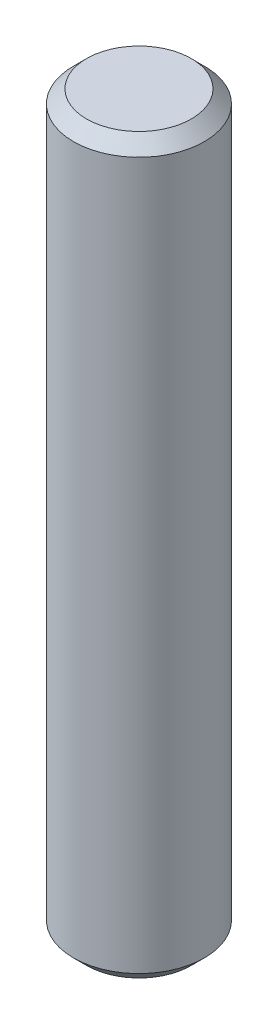
ISO-10303-21;
HEADER;
FILE_DESCRIPTION(('STEP AP214'),'2;1');
FILE_NAME('part.step','',(''),(''),'','','');
FILE_SCHEMA(('AUTOMOTIVE_DESIGN { 1 0 10303 214 1 1 1 1 }'));
ENDSEC;
DATA;
#1=APPLICATION_CONTEXT('core data for automotive mechanical design processes');
#2=APPLICATION_PROTOCOL_DEFINITION('international standard','automotive_design',2000,#1);
#3=PRODUCT_CONTEXT('',#1,'mechanical');
#4=PRODUCT('Part','Part','',(#3));
#5=PRODUCT_RELATED_PRODUCT_CATEGORY('part','',(#4));
#6=PRODUCT_DEFINITION_FORMATION('','',#4);
#7=PRODUCT_DEFINITION_CONTEXT('part definition',#1,'design');
#8=PRODUCT_DEFINITION('design','',#6,#7);
#9=PRODUCT_DEFINITION_SHAPE('','',#8);
#10=(LENGTH_UNIT() NAMED_UNIT(*) SI_UNIT(.MILLI.,.METRE.));
#11=(NAMED_UNIT(*) PLANE_ANGLE_UNIT() SI_UNIT($,.RADIAN.));
#12=(NAMED_UNIT(*) SI_UNIT($,.STERADIAN.) SOLID_ANGLE_UNIT());
#13=UNCERTAINTY_MEASURE_WITH_UNIT(LENGTH_MEASURE(1.E-05),#10,'distance_accuracy_value','');
#14=(GEOMETRIC_REPRESENTATION_CONTEXT(3) GLOBAL_UNCERTAINTY_ASSIGNED_CONTEXT((#13)) GLOBAL_UNIT_ASSIGNED_CONTEXT((#10,
#11,#12)) REPRESENTATION_CONTEXT('',''));
#15=CARTESIAN_POINT('',(0.,0.,0.));
#16=DIRECTION('',(0.,0.,1.));
#17=DIRECTION('',(1.,0.,0.));
#18=AXIS2_PLACEMENT_3D('',#15,#16,#17);
#19=CARTESIAN_POINT('',(0.,-14.,0.));
#20=DIRECTION('',(0.,1.,0.));
#21=DIRECTION('',(0.,0.,1.));
#22=AXIS2_PLACEMENT_3D('',#19,#20,#21);
#23=CYLINDRICAL_SURFACE('',#22,2.5);
#24=CARTESIAN_POINT('',(0.,-13.5,0.));
#25=DIRECTION('',(0.,1.,0.));
#26=DIRECTION('',(0.,0.,1.));
#27=AXIS2_PLACEMENT_3D('',#24,#25,#26);
#28=CIRCLE('',#27,2.5);
#29=CARTESIAN_POINT('',(0.,-13.5,2.5));
#30=VERTEX_POINT('',#29);
#31=EDGE_CURVE('E43',#30,#30,#28,.T.);
#32=ORIENTED_EDGE('',*,*,#31,.T.);
#33=EDGE_LOOP('',(#32));
#34=FACE_BOUND('',#33,.T.);
#35=CARTESIAN_POINT('',(0.,13.5,0.));
#36=DIRECTION('',(0.,1.,0.));
#37=DIRECTION('',(0.,0.,1.));
#38=AXIS2_PLACEMENT_3D('',#35,#36,#37);
#39=CIRCLE('',#38,2.5);
#40=CARTESIAN_POINT('',(0.,13.5,2.5));
#41=VERTEX_POINT('',#40);
#42=EDGE_CURVE('E47',#41,#41,#39,.F.);
#43=ORIENTED_EDGE('',*,*,#42,.T.);
#44=EDGE_LOOP('',(#43));
#45=FACE_BOUND('',#44,.T.);
#46=ADVANCED_FACE('F32',(#34,#45),#23,.T.);
#47=CARTESIAN_POINT('',(0.,-14.,0.));
#48=DIRECTION('',(0.,1.,0.));
#49=DIRECTION('',(0.,0.,1.));
#50=AXIS2_PLACEMENT_3D('',#47,#48,#49);
#51=PLANE('',#50);
#52=CARTESIAN_POINT('',(0.,-14.,0.));
#53=DIRECTION('',(0.,1.,0.));
#54=DIRECTION('',(0.,0.,1.));
#55=AXIS2_PLACEMENT_3D('',#52,#53,#54);
#56=CIRCLE('',#55,1.99999999999999);
#57=CARTESIAN_POINT('',(0.,-14.,1.99999999999999));
#58=VERTEX_POINT('',#57);
#59=EDGE_CURVE('E39',#58,#58,#56,.F.);
#60=ORIENTED_EDGE('',*,*,#59,.T.);
#61=EDGE_LOOP('',(#60));
#62=FACE_BOUND('',#61,.T.);
#63=ADVANCED_FACE('F63',(#62),#51,.F.);
#64=CARTESIAN_POINT('',(0.,14.,0.));
#65=DIRECTION('',(0.,1.,0.));
#66=DIRECTION('',(0.,0.,1.));
#67=AXIS2_PLACEMENT_3D('',#64,#65,#66);
#68=PLANE('',#67);
#69=CARTESIAN_POINT('',(0.,14.,0.));
#70=DIRECTION('',(0.,1.,0.));
#71=DIRECTION('',(0.,0.,1.));
#72=AXIS2_PLACEMENT_3D('',#69,#70,#71);
#73=CIRCLE('',#72,2.);
#74=CARTESIAN_POINT('',(0.,14.,2.));
#75=VERTEX_POINT('',#74);
#76=EDGE_CURVE('E10',#75,#75,#73,.T.);
#77=ORIENTED_EDGE('',*,*,#76,.T.);
#78=EDGE_LOOP('',(#77));
#79=FACE_BOUND('',#78,.T.);
#80=ADVANCED_FACE('F60',(#79),#68,.T.);
#81=CARTESIAN_POINT('',(0.,-13.5,0.));
#82=DIRECTION('',(0.,1.,0.));
#83=DIRECTION('',(0.,0.,1.));
#84=AXIS2_PLACEMENT_3D('',#81,#82,#83);
#85=CONICAL_SURFACE('',#84,2.5,0.785398163397449);
#86=ORIENTED_EDGE('',*,*,#59,.F.);
#87=EDGE_LOOP('',(#86));
#88=FACE_BOUND('',#87,.T.);
#89=ORIENTED_EDGE('',*,*,#31,.F.);
#90=EDGE_LOOP('',(#89));
#91=FACE_BOUND('',#90,.T.);
#92=ADVANCED_FACE('F56',(#88,#91),#85,.T.);
#93=CARTESIAN_POINT('',(0.,14.,0.));
#94=DIRECTION('',(0.,-1.,0.));
#95=DIRECTION('',(0.,0.,-1.));
#96=AXIS2_PLACEMENT_3D('',#93,#94,#95);
#97=CONICAL_SURFACE('',#96,2.,0.785398163397446);
#98=ORIENTED_EDGE('',*,*,#42,.F.);
#99=EDGE_LOOP('',(#98));
#100=FACE_BOUND('',#99,.T.);
#101=ORIENTED_EDGE('',*,*,#76,.F.);
#102=EDGE_LOOP('',(#101));
#103=FACE_BOUND('',#102,.T.);
#104=ADVANCED_FACE('F34',(#100,#103),#97,.T.);
#105=CLOSED_SHELL('',(#46,#63,#80,#92,#104));
#106=MANIFOLD_SOLID_BREP('B2',#105);
#107=ADVANCED_BREP_SHAPE_REPRESENTATION('',(#18,#106),#14);
#108=SHAPE_DEFINITION_REPRESENTATION(#9,#107);
ENDSEC;
END-ISO-10303-21;
